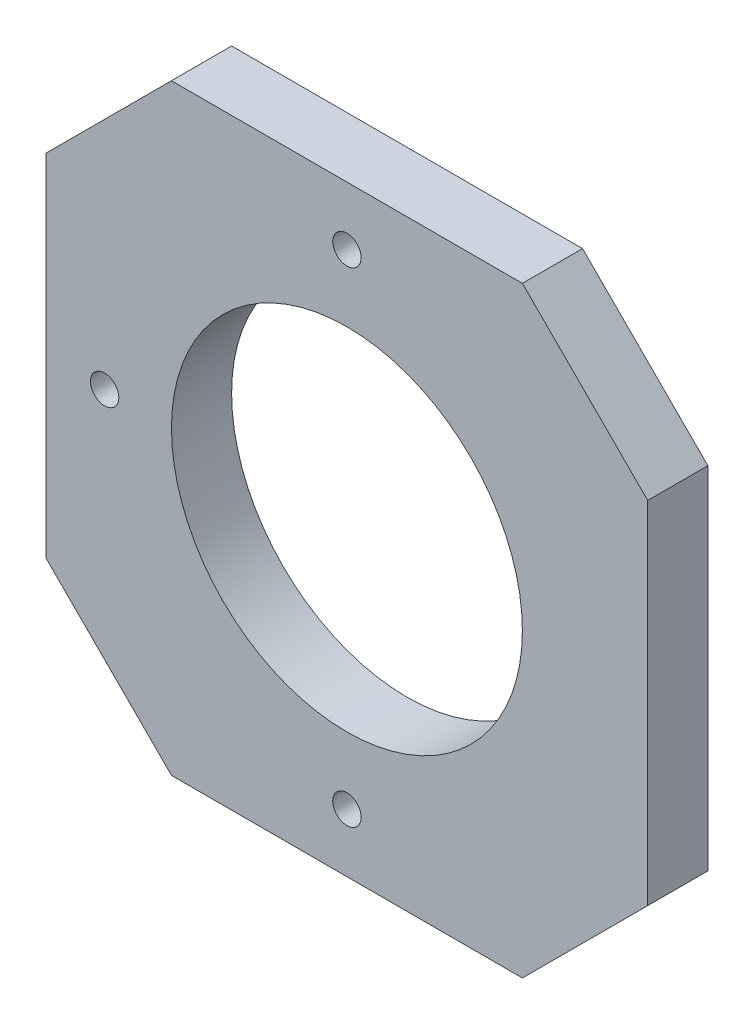
ISO-10303-21;
HEADER;
FILE_DESCRIPTION(('STEP AP214'),'2;1');
FILE_NAME('part.step','',(''),(''),'','','');
FILE_SCHEMA(('AUTOMOTIVE_DESIGN { 1 0 10303 214 1 1 1 1 }'));
ENDSEC;
DATA;
#1=APPLICATION_CONTEXT('core data for automotive mechanical design processes');
#2=APPLICATION_PROTOCOL_DEFINITION('international standard','automotive_design',2000,#1);
#3=PRODUCT_CONTEXT('',#1,'mechanical');
#4=PRODUCT('Part','Part','',(#3));
#5=PRODUCT_RELATED_PRODUCT_CATEGORY('part','',(#4));
#6=PRODUCT_DEFINITION_FORMATION('','',#4);
#7=PRODUCT_DEFINITION_CONTEXT('part definition',#1,'design');
#8=PRODUCT_DEFINITION('design','',#6,#7);
#9=PRODUCT_DEFINITION_SHAPE('','',#8);
#10=(LENGTH_UNIT() NAMED_UNIT(*) SI_UNIT(.MILLI.,.METRE.));
#11=(NAMED_UNIT(*) PLANE_ANGLE_UNIT() SI_UNIT($,.RADIAN.));
#12=(NAMED_UNIT(*) SI_UNIT($,.STERADIAN.) SOLID_ANGLE_UNIT());
#13=UNCERTAINTY_MEASURE_WITH_UNIT(LENGTH_MEASURE(1.E-05),#10,'distance_accuracy_value','');
#14=(GEOMETRIC_REPRESENTATION_CONTEXT(3) GLOBAL_UNCERTAINTY_ASSIGNED_CONTEXT((#13)) GLOBAL_UNIT_ASSIGNED_CONTEXT((#10,
#11,#12)) REPRESENTATION_CONTEXT('',''));
#15=CARTESIAN_POINT('',(0.,0.,0.));
#16=DIRECTION('',(0.,0.,1.));
#17=DIRECTION('',(1.,0.,0.));
#18=AXIS2_PLACEMENT_3D('',#15,#16,#17);
#19=CARTESIAN_POINT('',(0.,0.,7.2));
#20=DIRECTION('',(0.,0.,1.));
#21=DIRECTION('',(1.,0.,0.));
#22=AXIS2_PLACEMENT_3D('',#19,#20,#21);
#23=PLANE('',#22);
#24=CARTESIAN_POINT('',(0.,-29.,7.2));
#25=DIRECTION('',(0.,0.,1.));
#26=DIRECTION('',(1.,0.,0.));
#27=AXIS2_PLACEMENT_3D('',#24,#25,#26);
#28=CIRCLE('',#27,1.7);
#29=CARTESIAN_POINT('',(1.7,-29.,7.2));
#30=VERTEX_POINT('',#29);
#31=EDGE_CURVE('E196',#30,#30,#28,.T.);
#32=ORIENTED_EDGE('',*,*,#31,.F.);
#33=EDGE_LOOP('',(#32));
#34=FACE_BOUND('',#33,.T.);
#35=CARTESIAN_POINT('',(0.,0.,7.2));
#36=DIRECTION('',(0.,0.,1.));
#37=DIRECTION('',(1.,0.,0.));
#38=AXIS2_PLACEMENT_3D('',#35,#36,#37);
#39=CIRCLE('',#38,21.);
#40=CARTESIAN_POINT('',(21.,0.,7.2));
#41=VERTEX_POINT('',#40);
#42=EDGE_CURVE('E142',#41,#41,#39,.T.);
#43=ORIENTED_EDGE('',*,*,#42,.F.);
#44=EDGE_LOOP('',(#43));
#45=FACE_BOUND('',#44,.T.);
#46=DIRECTION('',(0.707106781186544,-0.707106781186551,0.));
#47=VECTOR('',#46,1.);
#48=CARTESIAN_POINT('',(-35.9999999999999,-21.,7.2));
#49=LINE('',#48,#47);
#50=CARTESIAN_POINT('',(-35.9999999999999,-21.,7.2));
#51=VERTEX_POINT('',#50);
#52=CARTESIAN_POINT('',(-21.,-36.,7.2));
#53=VERTEX_POINT('',#52);
#54=EDGE_CURVE('E153',#51,#53,#49,.T.);
#55=ORIENTED_EDGE('',*,*,#54,.T.);
#56=DIRECTION('',(1.,0.,0.));
#57=VECTOR('',#56,1.);
#58=CARTESIAN_POINT('',(-21.,-36.,7.2));
#59=LINE('',#58,#57);
#60=CARTESIAN_POINT('',(21.,-36.,7.2));
#61=VERTEX_POINT('',#60);
#62=EDGE_CURVE('E101',#53,#61,#59,.T.);
#63=ORIENTED_EDGE('',*,*,#62,.T.);
#64=DIRECTION('',(0.707106781186546,0.707106781186548,0.));
#65=VECTOR('',#64,1.);
#66=CARTESIAN_POINT('',(21.,-36.,7.2));
#67=LINE('',#66,#65);
#68=CARTESIAN_POINT('',(36.,-21.,7.2));
#69=VERTEX_POINT('',#68);
#70=EDGE_CURVE('E168',#61,#69,#67,.T.);
#71=ORIENTED_EDGE('',*,*,#70,.T.);
#72=DIRECTION('',(0.,1.,0.));
#73=VECTOR('',#72,1.);
#74=CARTESIAN_POINT('',(36.,-21.,7.2));
#75=LINE('',#74,#73);
#76=CARTESIAN_POINT('',(36.,21.,7.2));
#77=VERTEX_POINT('',#76);
#78=EDGE_CURVE('E181',#69,#77,#75,.T.);
#79=ORIENTED_EDGE('',*,*,#78,.T.);
#80=DIRECTION('',(-0.707106781186549,0.707106781186546,0.));
#81=VECTOR('',#80,1.);
#82=CARTESIAN_POINT('',(36.,21.,7.2));
#83=LINE('',#82,#81);
#84=CARTESIAN_POINT('',(21.,35.9999999999999,7.2));
#85=VERTEX_POINT('',#84);
#86=EDGE_CURVE('E120',#77,#85,#83,.T.);
#87=ORIENTED_EDGE('',*,*,#86,.T.);
#88=DIRECTION('',(-1.,0.,0.));
#89=VECTOR('',#88,1.);
#90=CARTESIAN_POINT('',(21.,35.9999999999999,7.2));
#91=LINE('',#90,#89);
#92=CARTESIAN_POINT('',(-21.,35.9999999999999,7.2));
#93=VERTEX_POINT('',#92);
#94=EDGE_CURVE('E114',#85,#93,#91,.T.);
#95=ORIENTED_EDGE('',*,*,#94,.T.);
#96=DIRECTION('',(-0.707106781186546,-0.707106781186549,0.));
#97=VECTOR('',#96,1.);
#98=CARTESIAN_POINT('',(-21.,35.9999999999999,7.2));
#99=LINE('',#98,#97);
#100=CARTESIAN_POINT('',(-35.9999999999999,21.,7.2));
#101=VERTEX_POINT('',#100);
#102=EDGE_CURVE('E118',#93,#101,#99,.T.);
#103=ORIENTED_EDGE('',*,*,#102,.T.);
#104=DIRECTION('',(0.,-1.,0.));
#105=VECTOR('',#104,1.);
#106=CARTESIAN_POINT('',(-35.9999999999999,21.,7.2));
#107=LINE('',#106,#105);
#108=EDGE_CURVE('E58',#101,#51,#107,.T.);
#109=ORIENTED_EDGE('',*,*,#108,.T.);
#110=EDGE_LOOP('',(#55,#63,#71,#79,#87,#95,#103,#109));
#111=FACE_BOUND('',#110,.T.);
#112=CARTESIAN_POINT('',(0.,29.,7.2));
#113=DIRECTION('',(0.,0.,1.));
#114=DIRECTION('',(1.,0.,0.));
#115=AXIS2_PLACEMENT_3D('',#112,#113,#114);
#116=CIRCLE('',#115,1.7);
#117=CARTESIAN_POINT('',(1.7,29.,7.2));
#118=VERTEX_POINT('',#117);
#119=EDGE_CURVE('E190',#118,#118,#116,.T.);
#120=ORIENTED_EDGE('',*,*,#119,.F.);
#121=EDGE_LOOP('',(#120));
#122=FACE_BOUND('',#121,.T.);
#123=CARTESIAN_POINT('',(-29.,0.,7.2));
#124=DIRECTION('',(0.,0.,1.));
#125=DIRECTION('',(1.,0.,0.));
#126=AXIS2_PLACEMENT_3D('',#123,#124,#125);
#127=CIRCLE('',#126,1.7);
#128=CARTESIAN_POINT('',(-27.3,0.,7.2));
#129=VERTEX_POINT('',#128);
#130=EDGE_CURVE('E202',#129,#129,#127,.T.);
#131=ORIENTED_EDGE('',*,*,#130,.F.);
#132=EDGE_LOOP('',(#131));
#133=FACE_BOUND('',#132,.T.);
#134=ADVANCED_FACE('F41',(#34,#45,#111,#122,#133),#23,.T.);
#135=CARTESIAN_POINT('',(0.,0.,0.));
#136=DIRECTION('',(0.,0.,1.));
#137=DIRECTION('',(1.,0.,0.));
#138=AXIS2_PLACEMENT_3D('',#135,#136,#137);
#139=PLANE('',#138);
#140=DIRECTION('',(0.707106781186544,-0.707106781186551,0.));
#141=VECTOR('',#140,1.);
#142=CARTESIAN_POINT('',(-35.9999999999999,-21.,0.));
#143=LINE('',#142,#141);
#144=CARTESIAN_POINT('',(-35.9999999999999,-21.,0.));
#145=VERTEX_POINT('',#144);
#146=CARTESIAN_POINT('',(-21.,-36.,0.));
#147=VERTEX_POINT('',#146);
#148=EDGE_CURVE('E138',#145,#147,#143,.T.);
#149=ORIENTED_EDGE('',*,*,#148,.F.);
#150=DIRECTION('',(0.,-1.,0.));
#151=VECTOR('',#150,1.);
#152=CARTESIAN_POINT('',(-35.9999999999999,21.,0.));
#153=LINE('',#152,#151);
#154=CARTESIAN_POINT('',(-35.9999999999999,21.,0.));
#155=VERTEX_POINT('',#154);
#156=EDGE_CURVE('E93',#155,#145,#153,.T.);
#157=ORIENTED_EDGE('',*,*,#156,.F.);
#158=DIRECTION('',(-0.707106781186546,-0.707106781186549,0.));
#159=VECTOR('',#158,1.);
#160=CARTESIAN_POINT('',(-21.,35.9999999999999,0.));
#161=LINE('',#160,#159);
#162=CARTESIAN_POINT('',(-21.,35.9999999999999,0.));
#163=VERTEX_POINT('',#162);
#164=EDGE_CURVE('E87',#163,#155,#161,.T.);
#165=ORIENTED_EDGE('',*,*,#164,.F.);
#166=DIRECTION('',(-1.,0.,0.));
#167=VECTOR('',#166,1.);
#168=CARTESIAN_POINT('',(21.,35.9999999999999,0.));
#169=LINE('',#168,#167);
#170=CARTESIAN_POINT('',(21.,35.9999999999999,0.));
#171=VERTEX_POINT('',#170);
#172=EDGE_CURVE('E128',#171,#163,#169,.T.);
#173=ORIENTED_EDGE('',*,*,#172,.F.);
#174=DIRECTION('',(-0.707106781186549,0.707106781186546,0.));
#175=VECTOR('',#174,1.);
#176=CARTESIAN_POINT('',(36.,21.,0.));
#177=LINE('',#176,#175);
#178=CARTESIAN_POINT('',(36.,21.,0.));
#179=VERTEX_POINT('',#178);
#180=EDGE_CURVE('E148',#179,#171,#177,.T.);
#181=ORIENTED_EDGE('',*,*,#180,.F.);
#182=DIRECTION('',(0.,1.,0.));
#183=VECTOR('',#182,1.);
#184=CARTESIAN_POINT('',(36.,-21.,0.));
#185=LINE('',#184,#183);
#186=CARTESIAN_POINT('',(36.,-21.,0.));
#187=VERTEX_POINT('',#186);
#188=EDGE_CURVE('E146',#187,#179,#185,.T.);
#189=ORIENTED_EDGE('',*,*,#188,.F.);
#190=DIRECTION('',(0.707106781186546,0.707106781186548,0.));
#191=VECTOR('',#190,1.);
#192=CARTESIAN_POINT('',(21.,-36.,0.));
#193=LINE('',#192,#191);
#194=CARTESIAN_POINT('',(21.,-36.,0.));
#195=VERTEX_POINT('',#194);
#196=EDGE_CURVE('E144',#195,#187,#193,.T.);
#197=ORIENTED_EDGE('',*,*,#196,.F.);
#198=DIRECTION('',(1.,0.,0.));
#199=VECTOR('',#198,1.);
#200=CARTESIAN_POINT('',(-21.,-36.,0.));
#201=LINE('',#200,#199);
#202=EDGE_CURVE('E141',#147,#195,#201,.T.);
#203=ORIENTED_EDGE('',*,*,#202,.F.);
#204=EDGE_LOOP('',(#149,#157,#165,#173,#181,#189,#197,#203));
#205=FACE_BOUND('',#204,.T.);
#206=CARTESIAN_POINT('',(0.,0.,0.));
#207=DIRECTION('',(0.,0.,1.));
#208=DIRECTION('',(1.,0.,0.));
#209=AXIS2_PLACEMENT_3D('',#206,#207,#208);
#210=CIRCLE('',#209,21.);
#211=CARTESIAN_POINT('',(21.,0.,0.));
#212=VERTEX_POINT('',#211);
#213=EDGE_CURVE('E187',#212,#212,#210,.T.);
#214=ORIENTED_EDGE('',*,*,#213,.T.);
#215=EDGE_LOOP('',(#214));
#216=FACE_BOUND('',#215,.T.);
#217=CARTESIAN_POINT('',(0.,29.,0.));
#218=DIRECTION('',(0.,0.,1.));
#219=DIRECTION('',(1.,0.,0.));
#220=AXIS2_PLACEMENT_3D('',#217,#218,#219);
#221=CIRCLE('',#220,1.7);
#222=CARTESIAN_POINT('',(1.7,29.,0.));
#223=VERTEX_POINT('',#222);
#224=EDGE_CURVE('E193',#223,#223,#221,.T.);
#225=ORIENTED_EDGE('',*,*,#224,.T.);
#226=EDGE_LOOP('',(#225));
#227=FACE_BOUND('',#226,.T.);
#228=CARTESIAN_POINT('',(0.,-29.,0.));
#229=DIRECTION('',(0.,0.,1.));
#230=DIRECTION('',(1.,0.,0.));
#231=AXIS2_PLACEMENT_3D('',#228,#229,#230);
#232=CIRCLE('',#231,1.7);
#233=CARTESIAN_POINT('',(1.7,-29.,0.));
#234=VERTEX_POINT('',#233);
#235=EDGE_CURVE('E199',#234,#234,#232,.T.);
#236=ORIENTED_EDGE('',*,*,#235,.T.);
#237=EDGE_LOOP('',(#236));
#238=FACE_BOUND('',#237,.T.);
#239=CARTESIAN_POINT('',(-29.,0.,0.));
#240=DIRECTION('',(0.,0.,1.));
#241=DIRECTION('',(1.,0.,0.));
#242=AXIS2_PLACEMENT_3D('',#239,#240,#241);
#243=CIRCLE('',#242,1.7);
#244=CARTESIAN_POINT('',(-27.3,0.,0.));
#245=VERTEX_POINT('',#244);
#246=EDGE_CURVE('E205',#245,#245,#243,.T.);
#247=ORIENTED_EDGE('',*,*,#246,.T.);
#248=EDGE_LOOP('',(#247));
#249=FACE_BOUND('',#248,.T.);
#250=ADVANCED_FACE('F172',(#205,#216,#227,#238,#249),#139,.F.);
#251=CARTESIAN_POINT('',(-35.9999999999999,-21.,7.2));
#252=DIRECTION('',(0.707106781186551,0.707106781186544,0.));
#253=DIRECTION('',(-0.707106781186544,0.707106781186551,0.));
#254=AXIS2_PLACEMENT_3D('',#251,#252,#253);
#255=PLANE('',#254);
#256=ORIENTED_EDGE('',*,*,#148,.T.);
#257=DIRECTION('',(0.,0.,-1.));
#258=VECTOR('',#257,1.);
#259=CARTESIAN_POINT('',(-21.,-36.,7.2));
#260=LINE('',#259,#258);
#261=EDGE_CURVE('E11',#53,#147,#260,.T.);
#262=ORIENTED_EDGE('',*,*,#261,.F.);
#263=ORIENTED_EDGE('',*,*,#54,.F.);
#264=DIRECTION('',(0.,0.,-1.));
#265=VECTOR('',#264,1.);
#266=CARTESIAN_POINT('',(-35.9999999999999,-21.,7.2));
#267=LINE('',#266,#265);
#268=EDGE_CURVE('E134',#51,#145,#267,.T.);
#269=ORIENTED_EDGE('',*,*,#268,.T.);
#270=EDGE_LOOP('',(#256,#262,#263,#269));
#271=FACE_BOUND('',#270,.T.);
#272=ADVANCED_FACE('F43',(#271),#255,.F.);
#273=CARTESIAN_POINT('',(-21.,-36.,7.2));
#274=DIRECTION('',(0.,1.,0.));
#275=DIRECTION('',(0.,0.,1.));
#276=AXIS2_PLACEMENT_3D('',#273,#274,#275);
#277=PLANE('',#276);
#278=ORIENTED_EDGE('',*,*,#202,.T.);
#279=DIRECTION('',(0.,0.,-1.));
#280=VECTOR('',#279,1.);
#281=CARTESIAN_POINT('',(21.,-36.,7.2));
#282=LINE('',#281,#280);
#283=EDGE_CURVE('E50',#61,#195,#282,.T.);
#284=ORIENTED_EDGE('',*,*,#283,.F.);
#285=ORIENTED_EDGE('',*,*,#62,.F.);
#286=ORIENTED_EDGE('',*,*,#261,.T.);
#287=EDGE_LOOP('',(#278,#284,#285,#286));
#288=FACE_BOUND('',#287,.T.);
#289=ADVANCED_FACE('F239',(#288),#277,.F.);
#290=CARTESIAN_POINT('',(21.,-36.,7.2));
#291=DIRECTION('',(-0.707106781186549,0.707106781186546,0.));
#292=DIRECTION('',(-0.707106781186546,-0.707106781186549,0.));
#293=AXIS2_PLACEMENT_3D('',#290,#291,#292);
#294=PLANE('',#293);
#295=ORIENTED_EDGE('',*,*,#196,.T.);
#296=DIRECTION('',(0.,0.,-1.));
#297=VECTOR('',#296,1.);
#298=CARTESIAN_POINT('',(36.,-21.,7.2));
#299=LINE('',#298,#297);
#300=EDGE_CURVE('E160',#69,#187,#299,.T.);
#301=ORIENTED_EDGE('',*,*,#300,.F.);
#302=ORIENTED_EDGE('',*,*,#70,.F.);
#303=ORIENTED_EDGE('',*,*,#283,.T.);
#304=EDGE_LOOP('',(#295,#301,#302,#303));
#305=FACE_BOUND('',#304,.T.);
#306=ADVANCED_FACE('F166',(#305),#294,.F.);
#307=CARTESIAN_POINT('',(36.,-21.,7.2));
#308=DIRECTION('',(-1.,0.,0.));
#309=DIRECTION('',(0.,0.,1.));
#310=AXIS2_PLACEMENT_3D('',#307,#308,#309);
#311=PLANE('',#310);
#312=ORIENTED_EDGE('',*,*,#188,.T.);
#313=DIRECTION('',(0.,0.,-1.));
#314=VECTOR('',#313,1.);
#315=CARTESIAN_POINT('',(36.,21.,7.2));
#316=LINE('',#315,#314);
#317=EDGE_CURVE('E157',#77,#179,#316,.T.);
#318=ORIENTED_EDGE('',*,*,#317,.F.);
#319=ORIENTED_EDGE('',*,*,#78,.F.);
#320=ORIENTED_EDGE('',*,*,#300,.T.);
#321=EDGE_LOOP('',(#312,#318,#319,#320));
#322=FACE_BOUND('',#321,.T.);
#323=ADVANCED_FACE('F177',(#322),#311,.F.);
#324=CARTESIAN_POINT('',(36.,21.,7.2));
#325=DIRECTION('',(-0.707106781186546,-0.707106781186549,0.));
#326=DIRECTION('',(0.707106781186549,-0.707106781186546,0.));
#327=AXIS2_PLACEMENT_3D('',#324,#325,#326);
#328=PLANE('',#327);
#329=ORIENTED_EDGE('',*,*,#180,.T.);
#330=DIRECTION('',(0.,0.,-1.));
#331=VECTOR('',#330,1.);
#332=CARTESIAN_POINT('',(21.,35.9999999999999,7.2));
#333=LINE('',#332,#331);
#334=EDGE_CURVE('E129',#85,#171,#333,.T.);
#335=ORIENTED_EDGE('',*,*,#334,.F.);
#336=ORIENTED_EDGE('',*,*,#86,.F.);
#337=ORIENTED_EDGE('',*,*,#317,.T.);
#338=EDGE_LOOP('',(#329,#335,#336,#337));
#339=FACE_BOUND('',#338,.T.);
#340=ADVANCED_FACE('F180',(#339),#328,.F.);
#341=CARTESIAN_POINT('',(21.,35.9999999999999,7.2));
#342=DIRECTION('',(0.,-1.,0.));
#343=DIRECTION('',(0.,0.,-1.));
#344=AXIS2_PLACEMENT_3D('',#341,#342,#343);
#345=PLANE('',#344);
#346=ORIENTED_EDGE('',*,*,#172,.T.);
#347=DIRECTION('',(0.,0.,-1.));
#348=VECTOR('',#347,1.);
#349=CARTESIAN_POINT('',(-21.,35.9999999999999,7.2));
#350=LINE('',#349,#348);
#351=EDGE_CURVE('E125',#93,#163,#350,.T.);
#352=ORIENTED_EDGE('',*,*,#351,.F.);
#353=ORIENTED_EDGE('',*,*,#94,.F.);
#354=ORIENTED_EDGE('',*,*,#334,.T.);
#355=EDGE_LOOP('',(#346,#352,#353,#354));
#356=FACE_BOUND('',#355,.T.);
#357=ADVANCED_FACE('F126',(#356),#345,.F.);
#358=CARTESIAN_POINT('',(-21.,35.9999999999999,7.2));
#359=DIRECTION('',(0.707106781186549,-0.707106781186546,0.));
#360=DIRECTION('',(0.707106781186546,0.707106781186549,0.));
#361=AXIS2_PLACEMENT_3D('',#358,#359,#360);
#362=PLANE('',#361);
#363=ORIENTED_EDGE('',*,*,#164,.T.);
#364=DIRECTION('',(0.,0.,-1.));
#365=VECTOR('',#364,1.);
#366=CARTESIAN_POINT('',(-35.9999999999999,21.,7.2));
#367=LINE('',#366,#365);
#368=EDGE_CURVE('E130',#101,#155,#367,.T.);
#369=ORIENTED_EDGE('',*,*,#368,.F.);
#370=ORIENTED_EDGE('',*,*,#102,.F.);
#371=ORIENTED_EDGE('',*,*,#351,.T.);
#372=EDGE_LOOP('',(#363,#369,#370,#371));
#373=FACE_BOUND('',#372,.T.);
#374=ADVANCED_FACE('F132',(#373),#362,.F.);
#375=CARTESIAN_POINT('',(-35.9999999999999,21.,7.2));
#376=DIRECTION('',(1.,0.,0.));
#377=DIRECTION('',(0.,0.,-1.));
#378=AXIS2_PLACEMENT_3D('',#375,#376,#377);
#379=PLANE('',#378);
#380=ORIENTED_EDGE('',*,*,#156,.T.);
#381=ORIENTED_EDGE('',*,*,#268,.F.);
#382=ORIENTED_EDGE('',*,*,#108,.F.);
#383=ORIENTED_EDGE('',*,*,#368,.T.);
#384=EDGE_LOOP('',(#380,#381,#382,#383));
#385=FACE_BOUND('',#384,.T.);
#386=ADVANCED_FACE('F227',(#385),#379,.F.);
#387=CARTESIAN_POINT('',(0.,0.,7.2));
#388=DIRECTION('',(0.,0.,-1.));
#389=DIRECTION('',(-1.,0.,0.));
#390=AXIS2_PLACEMENT_3D('',#387,#388,#389);
#391=CYLINDRICAL_SURFACE('',#390,21.);
#392=ORIENTED_EDGE('',*,*,#42,.T.);
#393=EDGE_LOOP('',(#392));
#394=FACE_BOUND('',#393,.T.);
#395=ORIENTED_EDGE('',*,*,#213,.F.);
#396=EDGE_LOOP('',(#395));
#397=FACE_BOUND('',#396,.T.);
#398=ADVANCED_FACE('F224',(#394,#397),#391,.F.);
#399=CARTESIAN_POINT('',(0.,29.,7.2));
#400=DIRECTION('',(0.,0.,-1.));
#401=DIRECTION('',(-1.,0.,0.));
#402=AXIS2_PLACEMENT_3D('',#399,#400,#401);
#403=CYLINDRICAL_SURFACE('',#402,1.7);
#404=ORIENTED_EDGE('',*,*,#119,.T.);
#405=EDGE_LOOP('',(#404));
#406=FACE_BOUND('',#405,.T.);
#407=ORIENTED_EDGE('',*,*,#224,.F.);
#408=EDGE_LOOP('',(#407));
#409=FACE_BOUND('',#408,.T.);
#410=ADVANCED_FACE('F302',(#406,#409),#403,.F.);
#411=CARTESIAN_POINT('',(0.,-29.,7.2));
#412=DIRECTION('',(0.,0.,-1.));
#413=DIRECTION('',(-1.,0.,0.));
#414=AXIS2_PLACEMENT_3D('',#411,#412,#413);
#415=CYLINDRICAL_SURFACE('',#414,1.7);
#416=ORIENTED_EDGE('',*,*,#31,.T.);
#417=EDGE_LOOP('',(#416));
#418=FACE_BOUND('',#417,.T.);
#419=ORIENTED_EDGE('',*,*,#235,.F.);
#420=EDGE_LOOP('',(#419));
#421=FACE_BOUND('',#420,.T.);
#422=ADVANCED_FACE('F310',(#418,#421),#415,.F.);
#423=CARTESIAN_POINT('',(-29.,0.,7.2));
#424=DIRECTION('',(0.,0.,-1.));
#425=DIRECTION('',(-1.,0.,0.));
#426=AXIS2_PLACEMENT_3D('',#423,#424,#425);
#427=CYLINDRICAL_SURFACE('',#426,1.7);
#428=ORIENTED_EDGE('',*,*,#130,.T.);
#429=EDGE_LOOP('',(#428));
#430=FACE_BOUND('',#429,.T.);
#431=ORIENTED_EDGE('',*,*,#246,.F.);
#432=EDGE_LOOP('',(#431));
#433=FACE_BOUND('',#432,.T.);
#434=ADVANCED_FACE('F211',(#430,#433),#427,.F.);
#435=CLOSED_SHELL('',(#134,#250,#272,#289,#306,#323,#340,#357,#374,#386,#398,#410,#422,#434));
#436=MANIFOLD_SOLID_BREP('B2',#435);
#437=ADVANCED_BREP_SHAPE_REPRESENTATION('',(#18,#436),#14);
#438=SHAPE_DEFINITION_REPRESENTATION(#9,#437);
ENDSEC;
END-ISO-10303-21;
